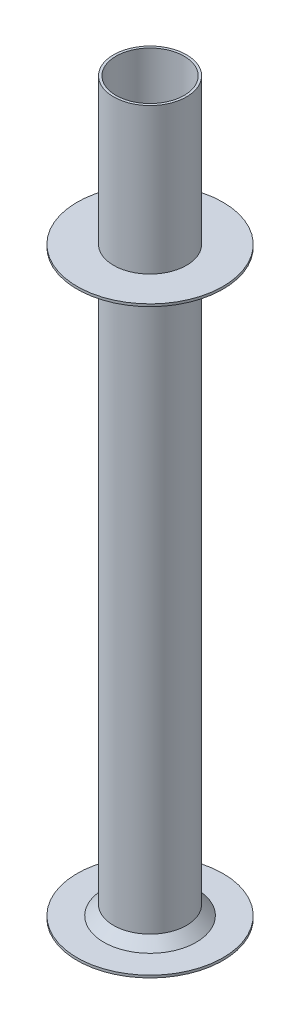
ISO-10303-21;
HEADER;
FILE_DESCRIPTION(('STEP AP214'),'2;1');
FILE_NAME('part.step','',(''),(''),'','','');
FILE_SCHEMA(('AUTOMOTIVE_DESIGN { 1 0 10303 214 1 1 1 1 }'));
ENDSEC;
DATA;
#1=APPLICATION_CONTEXT('core data for automotive mechanical design processes');
#2=APPLICATION_PROTOCOL_DEFINITION('international standard','automotive_design',2000,#1);
#3=PRODUCT_CONTEXT('',#1,'mechanical');
#4=PRODUCT('Part','Part','',(#3));
#5=PRODUCT_RELATED_PRODUCT_CATEGORY('part','',(#4));
#6=PRODUCT_DEFINITION_FORMATION('','',#4);
#7=PRODUCT_DEFINITION_CONTEXT('part definition',#1,'design');
#8=PRODUCT_DEFINITION('design','',#6,#7);
#9=PRODUCT_DEFINITION_SHAPE('','',#8);
#10=(LENGTH_UNIT() NAMED_UNIT(*) SI_UNIT(.MILLI.,.METRE.));
#11=(NAMED_UNIT(*) PLANE_ANGLE_UNIT() SI_UNIT($,.RADIAN.));
#12=(NAMED_UNIT(*) SI_UNIT($,.STERADIAN.) SOLID_ANGLE_UNIT());
#13=UNCERTAINTY_MEASURE_WITH_UNIT(LENGTH_MEASURE(1.E-05),#10,'distance_accuracy_value','');
#14=(GEOMETRIC_REPRESENTATION_CONTEXT(3) GLOBAL_UNCERTAINTY_ASSIGNED_CONTEXT((#13)) GLOBAL_UNIT_ASSIGNED_CONTEXT((#10,
#11,#12)) REPRESENTATION_CONTEXT('',''));
#15=CARTESIAN_POINT('',(0.,0.,0.));
#16=DIRECTION('',(0.,0.,1.));
#17=DIRECTION('',(1.,0.,0.));
#18=AXIS2_PLACEMENT_3D('',#15,#16,#17);
#19=CARTESIAN_POINT('',(0.,1500.,0.));
#20=DIRECTION('',(0.,-1.,0.));
#21=DIRECTION('',(0.,0.,-1.));
#22=AXIS2_PLACEMENT_3D('',#19,#20,#21);
#23=CYLINDRICAL_SURFACE('',#22,75.);
#24=CARTESIAN_POINT('',(0.,1175.,0.));
#25=DIRECTION('',(0.,1.,0.));
#26=DIRECTION('',(0.,0.,1.));
#27=AXIS2_PLACEMENT_3D('',#24,#25,#26);
#28=CIRCLE('',#27,75.);
#29=CARTESIAN_POINT('',(0.,1175.,75.));
#30=VERTEX_POINT('',#29);
#31=EDGE_CURVE('E55',#30,#30,#28,.F.);
#32=ORIENTED_EDGE('',*,*,#31,.T.);
#33=EDGE_LOOP('',(#32));
#34=FACE_BOUND('',#33,.T.);
#35=CARTESIAN_POINT('',(0.,25.0000000000002,0.));
#36=DIRECTION('',(0.,-1.,0.));
#37=DIRECTION('',(0.,0.,-1.));
#38=AXIS2_PLACEMENT_3D('',#35,#36,#37);
#39=CIRCLE('',#38,75.);
#40=CARTESIAN_POINT('',(0.,25.0000000000002,-75.));
#41=VERTEX_POINT('',#40);
#42=EDGE_CURVE('E45',#41,#41,#39,.F.);
#43=ORIENTED_EDGE('',*,*,#42,.T.);
#44=EDGE_LOOP('',(#43));
#45=FACE_BOUND('',#44,.T.);
#46=ADVANCED_FACE('F37',(#34,#45),#23,.T.);
#47=CARTESIAN_POINT('',(0.,5.,0.));
#48=DIRECTION('',(0.,-1.,0.));
#49=DIRECTION('',(0.,0.,-1.));
#50=AXIS2_PLACEMENT_3D('',#47,#48,#49);
#51=CONICAL_SURFACE('',#50,95.,0.785398163397443);
#52=CARTESIAN_POINT('',(0.,5.,0.));
#53=DIRECTION('',(0.,-1.,0.));
#54=DIRECTION('',(0.,0.,-1.));
#55=AXIS2_PLACEMENT_3D('',#52,#53,#54);
#56=CIRCLE('',#55,95.);
#57=CARTESIAN_POINT('',(0.,5.,-95.));
#58=VERTEX_POINT('',#57);
#59=EDGE_CURVE('E64',#58,#58,#56,.T.);
#60=ORIENTED_EDGE('',*,*,#59,.F.);
#61=EDGE_LOOP('',(#60));
#62=FACE_BOUND('',#61,.T.);
#63=ORIENTED_EDGE('',*,*,#42,.F.);
#64=EDGE_LOOP('',(#63));
#65=FACE_BOUND('',#64,.T.);
#66=ADVANCED_FACE('F92',(#62,#65),#51,.T.);
#67=CARTESIAN_POINT('',(0.,-133.291718303454,0.));
#68=DIRECTION('',(0.,-1.,0.));
#69=DIRECTION('',(0.,0.,-1.));
#70=AXIS2_PLACEMENT_3D('',#67,#68,#69);
#71=CYLINDRICAL_SURFACE('',#70,150.);
#72=CARTESIAN_POINT('',(0.,5.,0.));
#73=DIRECTION('',(0.,-1.,0.));
#74=DIRECTION('',(0.,0.,-1.));
#75=AXIS2_PLACEMENT_3D('',#72,#73,#74);
#76=CIRCLE('',#75,150.);
#77=CARTESIAN_POINT('',(0.,5.,-150.));
#78=VERTEX_POINT('',#77);
#79=EDGE_CURVE('E78',#78,#78,#76,.T.);
#80=ORIENTED_EDGE('',*,*,#79,.T.);
#81=EDGE_LOOP('',(#80));
#82=FACE_BOUND('',#81,.T.);
#83=CARTESIAN_POINT('',(0.,0.,0.));
#84=DIRECTION('',(0.,-1.,0.));
#85=DIRECTION('',(0.,0.,-1.));
#86=AXIS2_PLACEMENT_3D('',#83,#84,#85);
#87=CIRCLE('',#86,150.);
#88=CARTESIAN_POINT('',(0.,0.,-150.));
#89=VERTEX_POINT('',#88);
#90=EDGE_CURVE('E51',#89,#89,#87,.T.);
#91=ORIENTED_EDGE('',*,*,#90,.F.);
#92=EDGE_LOOP('',(#91));
#93=FACE_BOUND('',#92,.T.);
#94=ADVANCED_FACE('F89',(#82,#93),#71,.T.);
#95=CARTESIAN_POINT('',(150.,5.,0.));
#96=DIRECTION('',(0.,1.,0.));
#97=DIRECTION('',(0.,0.,1.));
#98=AXIS2_PLACEMENT_3D('',#95,#96,#97);
#99=PLANE('',#98);
#100=ORIENTED_EDGE('',*,*,#59,.T.);
#101=EDGE_LOOP('',(#100));
#102=FACE_BOUND('',#101,.T.);
#103=ORIENTED_EDGE('',*,*,#79,.F.);
#104=EDGE_LOOP('',(#103));
#105=FACE_BOUND('',#104,.T.);
#106=ADVANCED_FACE('F91',(#102,#105),#99,.T.);
#107=CARTESIAN_POINT('',(0.,0.,0.));
#108=DIRECTION('',(0.,1.,0.));
#109=DIRECTION('',(0.,0.,1.));
#110=AXIS2_PLACEMENT_3D('',#107,#108,#109);
#111=PLANE('',#110);
#112=CARTESIAN_POINT('',(0.,0.,0.));
#113=DIRECTION('',(0.,1.,0.));
#114=DIRECTION('',(0.,0.,1.));
#115=AXIS2_PLACEMENT_3D('',#112,#113,#114);
#116=CIRCLE('',#115,70.);
#117=CARTESIAN_POINT('',(0.,0.,70.));
#118=VERTEX_POINT('',#117);
#119=EDGE_CURVE('E146',#118,#118,#116,.T.);
#120=ORIENTED_EDGE('',*,*,#119,.T.);
#121=EDGE_LOOP('',(#120));
#122=FACE_BOUND('',#121,.T.);
#123=ORIENTED_EDGE('',*,*,#90,.T.);
#124=EDGE_LOOP('',(#123));
#125=FACE_BOUND('',#124,.T.);
#126=ADVANCED_FACE('F87',(#122,#125),#111,.F.);
#127=CARTESIAN_POINT('',(0.,1100.,0.));
#128=DIRECTION('',(0.,1.,0.));
#129=DIRECTION('',(0.,0.,1.));
#130=AXIS2_PLACEMENT_3D('',#127,#128,#129);
#131=CONICAL_SURFACE('',#130,0.,0.785398163397443);
#132=CARTESIAN_POINT('',(0.,1195.,0.));
#133=DIRECTION('',(0.,-1.,0.));
#134=DIRECTION('',(0.,0.,-1.));
#135=AXIS2_PLACEMENT_3D('',#132,#133,#134);
#136=CIRCLE('',#135,95.);
#137=CARTESIAN_POINT('',(0.,1195.,-95.));
#138=VERTEX_POINT('',#137);
#139=EDGE_CURVE('E72',#138,#138,#136,.T.);
#140=ORIENTED_EDGE('',*,*,#139,.T.);
#141=EDGE_LOOP('',(#140));
#142=FACE_BOUND('',#141,.T.);
#143=ORIENTED_EDGE('',*,*,#31,.F.);
#144=EDGE_LOOP('',(#143));
#145=FACE_BOUND('',#144,.T.);
#146=ADVANCED_FACE('F127',(#142,#145),#131,.T.);
#147=CARTESIAN_POINT('',(0.,1200.,0.));
#148=DIRECTION('',(0.,1.,0.));
#149=DIRECTION('',(0.,0.,1.));
#150=AXIS2_PLACEMENT_3D('',#147,#148,#149);
#151=PLANE('',#150);
#152=CARTESIAN_POINT('',(0.,1200.,0.));
#153=DIRECTION('',(0.,1.,0.));
#154=DIRECTION('',(0.,0.,1.));
#155=AXIS2_PLACEMENT_3D('',#152,#153,#154);
#156=CIRCLE('',#155,75.);
#157=CARTESIAN_POINT('',(0.,1200.,75.));
#158=VERTEX_POINT('',#157);
#159=EDGE_CURVE('E40',#158,#158,#156,.T.);
#160=ORIENTED_EDGE('',*,*,#159,.F.);
#161=EDGE_LOOP('',(#160));
#162=FACE_BOUND('',#161,.T.);
#163=CARTESIAN_POINT('',(0.,1200.,0.));
#164=DIRECTION('',(0.,-1.,0.));
#165=DIRECTION('',(0.,0.,-1.));
#166=AXIS2_PLACEMENT_3D('',#163,#164,#165);
#167=CIRCLE('',#166,150.);
#168=CARTESIAN_POINT('',(0.,1200.,-150.));
#169=VERTEX_POINT('',#168);
#170=EDGE_CURVE('E58',#169,#169,#167,.T.);
#171=ORIENTED_EDGE('',*,*,#170,.F.);
#172=EDGE_LOOP('',(#171));
#173=FACE_BOUND('',#172,.T.);
#174=ADVANCED_FACE('F123',(#162,#173),#151,.T.);
#175=CARTESIAN_POINT('',(0.,-133.291718303454,0.));
#176=DIRECTION('',(0.,-1.,0.));
#177=DIRECTION('',(0.,0.,-1.));
#178=AXIS2_PLACEMENT_3D('',#175,#176,#177);
#179=CYLINDRICAL_SURFACE('',#178,150.);
#180=ORIENTED_EDGE('',*,*,#170,.T.);
#181=EDGE_LOOP('',(#180));
#182=FACE_BOUND('',#181,.T.);
#183=CARTESIAN_POINT('',(0.,1195.,0.));
#184=DIRECTION('',(0.,-1.,0.));
#185=DIRECTION('',(0.,0.,-1.));
#186=AXIS2_PLACEMENT_3D('',#183,#184,#185);
#187=CIRCLE('',#186,150.);
#188=CARTESIAN_POINT('',(0.,1195.,-150.));
#189=VERTEX_POINT('',#188);
#190=EDGE_CURVE('E66',#189,#189,#187,.T.);
#191=ORIENTED_EDGE('',*,*,#190,.F.);
#192=EDGE_LOOP('',(#191));
#193=FACE_BOUND('',#192,.T.);
#194=ADVANCED_FACE('F126',(#182,#193),#179,.T.);
#195=CARTESIAN_POINT('',(150.,1195.,0.));
#196=DIRECTION('',(0.,-1.,0.));
#197=DIRECTION('',(0.,0.,-1.));
#198=AXIS2_PLACEMENT_3D('',#195,#196,#197);
#199=PLANE('',#198);
#200=ORIENTED_EDGE('',*,*,#190,.T.);
#201=EDGE_LOOP('',(#200));
#202=FACE_BOUND('',#201,.T.);
#203=ORIENTED_EDGE('',*,*,#139,.F.);
#204=EDGE_LOOP('',(#203));
#205=FACE_BOUND('',#204,.T.);
#206=ADVANCED_FACE('F118',(#202,#205),#199,.T.);
#207=CARTESIAN_POINT('',(0.,1500.,0.));
#208=DIRECTION('',(0.,1.,0.));
#209=DIRECTION('',(0.,0.,1.));
#210=AXIS2_PLACEMENT_3D('',#207,#208,#209);
#211=PLANE('',#210);
#212=CARTESIAN_POINT('',(0.,1500.,0.));
#213=DIRECTION('',(0.,1.,0.));
#214=DIRECTION('',(0.,0.,1.));
#215=AXIS2_PLACEMENT_3D('',#212,#213,#214);
#216=CIRCLE('',#215,70.);
#217=CARTESIAN_POINT('',(0.,1500.,70.));
#218=VERTEX_POINT('',#217);
#219=EDGE_CURVE('E149',#218,#218,#216,.T.);
#220=ORIENTED_EDGE('',*,*,#219,.F.);
#221=EDGE_LOOP('',(#220));
#222=FACE_BOUND('',#221,.T.);
#223=CARTESIAN_POINT('',(0.,1500.,0.));
#224=DIRECTION('',(0.,1.,0.));
#225=DIRECTION('',(0.,0.,1.));
#226=AXIS2_PLACEMENT_3D('',#223,#224,#225);
#227=CIRCLE('',#226,75.);
#228=CARTESIAN_POINT('',(0.,1500.,75.));
#229=VERTEX_POINT('',#228);
#230=EDGE_CURVE('E10',#229,#229,#227,.T.);
#231=ORIENTED_EDGE('',*,*,#230,.T.);
#232=EDGE_LOOP('',(#231));
#233=FACE_BOUND('',#232,.T.);
#234=ADVANCED_FACE('F110',(#222,#233),#211,.T.);
#235=ORIENTED_EDGE('',*,*,#159,.T.);
#236=EDGE_LOOP('',(#235));
#237=FACE_BOUND('',#236,.T.);
#238=ORIENTED_EDGE('',*,*,#230,.F.);
#239=EDGE_LOOP('',(#238));
#240=FACE_BOUND('',#239,.T.);
#241=ADVANCED_FACE('F104',(#237,#240),#23,.T.);
#242=CARTESIAN_POINT('',(0.,0.,0.));
#243=DIRECTION('',(0.,1.,0.));
#244=DIRECTION('',(0.,0.,1.));
#245=AXIS2_PLACEMENT_3D('',#242,#243,#244);
#246=CYLINDRICAL_SURFACE('',#245,70.);
#247=ORIENTED_EDGE('',*,*,#119,.F.);
#248=EDGE_LOOP('',(#247));
#249=FACE_BOUND('',#248,.T.);
#250=ORIENTED_EDGE('',*,*,#219,.T.);
#251=EDGE_LOOP('',(#250));
#252=FACE_BOUND('',#251,.T.);
#253=ADVANCED_FACE('F109',(#249,#252),#246,.F.);
#254=CLOSED_SHELL('',(#46,#66,#94,#106,#126,#146,#174,#194,#206,#234,#241,#253));
#255=MANIFOLD_SOLID_BREP('B2',#254);
#256=ADVANCED_BREP_SHAPE_REPRESENTATION('',(#18,#255),#14);
#257=SHAPE_DEFINITION_REPRESENTATION(#9,#256);
ENDSEC;
END-ISO-10303-21;
